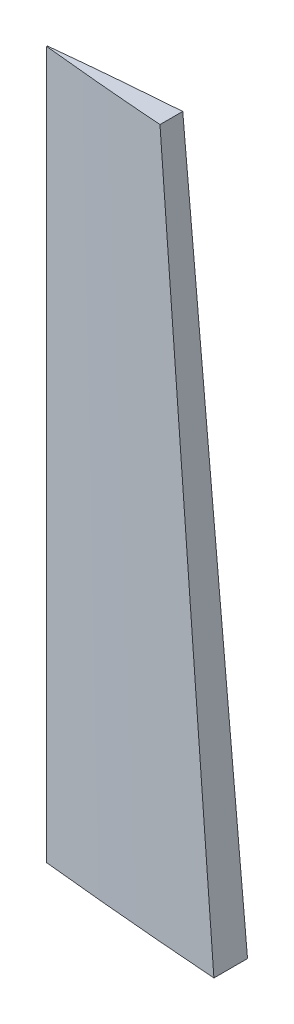
ISO-10303-21;
HEADER;
FILE_DESCRIPTION(('STEP AP214'),'2;1');
FILE_NAME('part.step','',(''),(''),'','','');
FILE_SCHEMA(('AUTOMOTIVE_DESIGN { 1 0 10303 214 1 1 1 1 }'));
ENDSEC;
DATA;
#1=APPLICATION_CONTEXT('core data for automotive mechanical design processes');
#2=APPLICATION_PROTOCOL_DEFINITION('international standard','automotive_design',2000,#1);
#3=PRODUCT_CONTEXT('',#1,'mechanical');
#4=PRODUCT('Part','Part','',(#3));
#5=PRODUCT_RELATED_PRODUCT_CATEGORY('part','',(#4));
#6=PRODUCT_DEFINITION_FORMATION('','',#4);
#7=PRODUCT_DEFINITION_CONTEXT('part definition',#1,'design');
#8=PRODUCT_DEFINITION('design','',#6,#7);
#9=PRODUCT_DEFINITION_SHAPE('','',#8);
#10=(LENGTH_UNIT() NAMED_UNIT(*) SI_UNIT(.MILLI.,.METRE.));
#11=(NAMED_UNIT(*) PLANE_ANGLE_UNIT() SI_UNIT($,.RADIAN.));
#12=(NAMED_UNIT(*) SI_UNIT($,.STERADIAN.) SOLID_ANGLE_UNIT());
#13=UNCERTAINTY_MEASURE_WITH_UNIT(LENGTH_MEASURE(1.E-05),#10,'distance_accuracy_value','');
#14=(GEOMETRIC_REPRESENTATION_CONTEXT(3) GLOBAL_UNCERTAINTY_ASSIGNED_CONTEXT((#13)) GLOBAL_UNIT_ASSIGNED_CONTEXT((#10,
#11,#12)) REPRESENTATION_CONTEXT('',''));
#15=CARTESIAN_POINT('',(0.,0.,0.));
#16=DIRECTION('',(0.,0.,1.));
#17=DIRECTION('',(1.,0.,0.));
#18=AXIS2_PLACEMENT_3D('',#15,#16,#17);
#19=CARTESIAN_POINT('',(-140.432322065666,194.49,-1.55593843981199));
#20=DIRECTION('',(0.,-1.,0.));
#21=DIRECTION('',(0.,0.,-1.));
#22=AXIS2_PLACEMENT_3D('',#19,#20,#21);
#23=PLANE('',#22);
#24=CARTESIAN_POINT('',(-125.25156,194.49,-2.77828691800495));
#25=CARTESIAN_POINT('',(-125.3651127687,194.49,-2.77027457637994));
#26=CARTESIAN_POINT('',(-127.051283805687,194.49,-2.65129748281203));
#27=CARTESIAN_POINT('',(-130.216658158444,194.49,-2.40616174222578));
#28=CARTESIAN_POINT('',(-134.639587715265,194.49,-2.05304884872815));
#29=CARTESIAN_POINT('',(-138.737880473123,194.49,-1.70632782621291));
#30=CARTESIAN_POINT('',(-142.46684265343,194.49,-1.37673059900453));
#31=CARTESIAN_POINT('',(-145.785564936787,194.49,-1.07112161812409));
#32=CARTESIAN_POINT('',(-148.657698888021,194.49,-0.797023477181364));
#33=CARTESIAN_POINT('',(-151.05177861747,194.49,-0.561384418051552));
#34=CARTESIAN_POINT('',(-152.941584481083,194.49,-0.370591439740743));
#35=CARTESIAN_POINT('',(-154.306419227171,194.49,-0.230051117494488));
#36=CARTESIAN_POINT('',(-155.131345863939,194.49,-0.143997076256146));
#37=CARTESIAN_POINT('',(-155.499662808457,194.49,-0.105279017395617));
#38=CARTESIAN_POINT('',(-155.592,194.49,-0.0955723859999983));
#39=B_SPLINE_CURVE_WITH_KNOTS('',3,(#24,#25,#26,#27,#28,#29,#30,#31,#32,#33,#34,#35,#36,#37,
#38),.UNSPECIFIED.,.F.,.F.,(4,1,1,1,1,1,1,1,1,1,1,1,4),(0.,0.0112115722778323,0.166483201337751,
0.312686160175411,0.448210552609216,0.571562715657405,0.681381362004341,0.776452466822885,
0.855722863352052,0.918312437422216,0.963524724344558,0.990855635167136,1.),.UNSPECIFIED.);
#40=CARTESIAN_POINT('',(-125.25156,194.49,-2.77828691800495));
#41=VERTEX_POINT('',#40);
#42=CARTESIAN_POINT('',(-155.592,194.49,-0.0955723859999983));
#43=VERTEX_POINT('',#42);
#44=EDGE_CURVE('E122',#41,#43,#39,.T.);
#45=ORIENTED_EDGE('',*,*,#44,.T.);
#46=DIRECTION('',(0.,0.,1.));
#47=VECTOR('',#46,1.);
#48=CARTESIAN_POINT('',(-155.592,194.49,-0.0955723859999983));
#49=LINE('',#48,#47);
#50=CARTESIAN_POINT('',(-155.592,194.49,0.0955723859999983));
#51=VERTEX_POINT('',#50);
#52=EDGE_CURVE('E254',#43,#51,#49,.T.);
#53=ORIENTED_EDGE('',*,*,#52,.T.);
#54=CARTESIAN_POINT('',(-155.592,194.49,0.0955723859999983));
#55=CARTESIAN_POINT('',(-155.499662808457,194.49,0.105279017395617));
#56=CARTESIAN_POINT('',(-155.131345863939,194.49,0.143997076256146));
#57=CARTESIAN_POINT('',(-154.306419227171,194.49,0.230051117494488));
#58=CARTESIAN_POINT('',(-152.941584481083,194.49,0.370591439740743));
#59=CARTESIAN_POINT('',(-151.05177861747,194.49,0.561384418051552));
#60=CARTESIAN_POINT('',(-148.657698888021,194.49,0.797023477181364));
#61=CARTESIAN_POINT('',(-145.785564936787,194.49,1.07112161812409));
#62=CARTESIAN_POINT('',(-142.46684265343,194.49,1.37673059900453));
#63=CARTESIAN_POINT('',(-138.737880473123,194.49,1.70632782621291));
#64=CARTESIAN_POINT('',(-134.639587715265,194.49,2.05304884872815));
#65=CARTESIAN_POINT('',(-130.216658158444,194.49,2.40616174222578));
#66=CARTESIAN_POINT('',(-127.051283805687,194.49,2.65129748281203));
#67=CARTESIAN_POINT('',(-125.3651127687,194.49,2.77027457637994));
#68=CARTESIAN_POINT('',(-125.25156,194.49,2.77828691800495));
#69=B_SPLINE_CURVE_WITH_KNOTS('',3,(#54,#55,#56,#57,#58,#59,#60,#61,#62,#63,#64,#65,#66,#67,
#68),.UNSPECIFIED.,.F.,.F.,(4,1,1,1,1,1,1,1,1,1,1,1,4),(0.,0.00914436483286374,
0.0364752756554418,0.0816875625777836,0.144277136647948,0.223547533177115,0.318618637995659,
0.428437284342595,0.551789447390784,0.687313839824589,0.833516798662249,0.988788427722168,1.),.UNSPECIFIED.);
#70=CARTESIAN_POINT('',(-125.25156,194.49,2.77828691800495));
#71=VERTEX_POINT('',#70);
#72=EDGE_CURVE('E79',#51,#71,#69,.T.);
#73=ORIENTED_EDGE('',*,*,#72,.T.);
#74=DIRECTION('',(0.,0.,-1.));
#75=VECTOR('',#74,1.);
#76=CARTESIAN_POINT('',(-125.25156,194.49,-2.77828691800495));
#77=LINE('',#76,#75);
#78=EDGE_CURVE('E12',#71,#41,#77,.T.);
#79=ORIENTED_EDGE('',*,*,#78,.T.);
#80=EDGE_LOOP('',(#45,#53,#73,#79));
#81=FACE_BOUND('',#80,.T.);
#82=ADVANCED_FACE('F69',(#81),#23,.F.);
#83=CARTESIAN_POINT('',(-133.192776457922,22.,-2.29898109194842));
#84=DIRECTION('',(0.,-1.,0.));
#85=DIRECTION('',(0.,0.,-1.));
#86=AXIS2_PLACEMENT_3D('',#83,#84,#85);
#87=PLANE('',#86);
#88=CARTESIAN_POINT('',(-110.7624,22.,-4.10506542487171));
#89=CARTESIAN_POINT('',(-110.930180203574,22.,-4.09322676761716));
#90=CARTESIAN_POINT('',(-113.421586825222,22.,-3.91743183801785));
#91=CARTESIAN_POINT('',(-118.098594346681,22.,-3.55523085490141));
#92=CARTESIAN_POINT('',(-124.633705995043,22.,-3.03348793455017));
#93=CARTESIAN_POINT('',(-130.689149654319,22.,-2.52118934062902));
#94=CARTESIAN_POINT('',(-136.198887909872,22.,-2.03419205723891));
#95=CARTESIAN_POINT('',(-141.102475085074,22.,-1.58263867273697));
#96=CARTESIAN_POINT('',(-145.346204450246,22.,-1.17764421586007));
#97=CARTESIAN_POINT('',(-148.883583494166,22.,-0.829475080370754));
#98=CARTESIAN_POINT('',(-151.675871310144,22.,-0.547568394097166));
#99=CARTESIAN_POINT('',(-153.692486617412,22.,-0.339912657062029));
#100=CARTESIAN_POINT('',(-154.911359222939,22.,-0.212763273364937));
#101=CARTESIAN_POINT('',(-155.455566930407,22.,-0.155555299733246));
#102=CARTESIAN_POINT('',(-155.592,22.,-0.141213239999997));
#103=B_SPLINE_CURVE_WITH_KNOTS('',3,(#88,#89,#90,#91,#92,#93,#94,#95,#96,#97,#98,#99,#100,#101,
#102),.UNSPECIFIED.,.F.,.F.,(4,1,1,1,1,1,1,1,1,1,1,1,4),(0.,0.011211572277832,0.166483201337751,
0.312686160175411,0.448210552609216,0.571562715657405,0.681381362004341,0.776452466822885,
0.855722863352053,0.918312437422216,0.963524724344559,0.990855635167136,1.),.UNSPECIFIED.);
#104=CARTESIAN_POINT('',(-110.7624,22.,-4.10506542487171));
#105=VERTEX_POINT('',#104);
#106=CARTESIAN_POINT('',(-155.592,22.,-0.141213239999997));
#107=VERTEX_POINT('',#106);
#108=EDGE_CURVE('E119',#105,#107,#103,.T.);
#109=ORIENTED_EDGE('',*,*,#108,.F.);
#110=DIRECTION('',(0.,0.,-1.));
#111=VECTOR('',#110,1.);
#112=CARTESIAN_POINT('',(-110.7624,22.,-4.10506542487171));
#113=LINE('',#112,#111);
#114=CARTESIAN_POINT('',(-110.7624,22.,4.10506542487171));
#115=VERTEX_POINT('',#114);
#116=EDGE_CURVE('E126',#115,#105,#113,.T.);
#117=ORIENTED_EDGE('',*,*,#116,.F.);
#118=CARTESIAN_POINT('',(-155.592,22.,0.141213239999997));
#119=CARTESIAN_POINT('',(-155.455566930407,22.,0.155555299733246));
#120=CARTESIAN_POINT('',(-154.911359222939,22.,0.212763273364937));
#121=CARTESIAN_POINT('',(-153.692486617412,22.,0.339912657062029));
#122=CARTESIAN_POINT('',(-151.675871310144,22.,0.547568394097166));
#123=CARTESIAN_POINT('',(-148.883583494166,22.,0.829475080370754));
#124=CARTESIAN_POINT('',(-145.346204450246,22.,1.17764421586007));
#125=CARTESIAN_POINT('',(-141.102475085074,22.,1.58263867273697));
#126=CARTESIAN_POINT('',(-136.198887909872,22.,2.03419205723891));
#127=CARTESIAN_POINT('',(-130.689149654319,22.,2.52118934062902));
#128=CARTESIAN_POINT('',(-124.633705995043,22.,3.03348793455017));
#129=CARTESIAN_POINT('',(-118.098594346681,22.,3.55523085490141));
#130=CARTESIAN_POINT('',(-113.421586825222,22.,3.91743183801785));
#131=CARTESIAN_POINT('',(-110.930180203574,22.,4.09322676761716));
#132=CARTESIAN_POINT('',(-110.7624,22.,4.10506542487171));
#133=B_SPLINE_CURVE_WITH_KNOTS('',3,(#118,#119,#120,#121,#122,#123,#124,#125,#126,#127,#128,
#129,#130,#131,#132),.UNSPECIFIED.,.F.,.F.,(4,1,1,1,1,1,1,1,1,1,1,1,4),(0.,0.00914436483286374,
0.0364752756554412,0.0816875625777839,0.144277136647947,0.223547533177115,0.318618637995659,
0.428437284342595,0.551789447390784,0.687313839824589,0.833516798662249,0.988788427722168,1.),.UNSPECIFIED.);
#134=CARTESIAN_POINT('',(-155.592,22.,0.141213239999997));
#135=VERTEX_POINT('',#134);
#136=EDGE_CURVE('E132',#135,#115,#133,.T.);
#137=ORIENTED_EDGE('',*,*,#136,.F.);
#138=DIRECTION('',(0.,0.,1.));
#139=VECTOR('',#138,1.);
#140=CARTESIAN_POINT('',(-155.592,22.,-0.141213239999997));
#141=LINE('',#140,#139);
#142=EDGE_CURVE('E138',#107,#135,#141,.T.);
#143=ORIENTED_EDGE('',*,*,#142,.F.);
#144=EDGE_LOOP('',(#109,#117,#137,#143));
#145=FACE_BOUND('',#144,.T.);
#146=ADVANCED_FACE('F136',(#145),#87,.T.);
#147=CARTESIAN_POINT('',(-110.7624,22.,-4.10506542487171));
#148=CARTESIAN_POINT('',(-125.25156,194.49,-2.77828691800495));
#149=CARTESIAN_POINT('',(-110.930180203574,22.,-4.09322676761716));
#150=CARTESIAN_POINT('',(-125.3651127687,194.49,-2.77027457637994));
#151=CARTESIAN_POINT('',(-113.421586825222,22.,-3.91743183801785));
#152=CARTESIAN_POINT('',(-127.051283805687,194.49,-2.65129748281203));
#153=CARTESIAN_POINT('',(-118.098594346681,22.,-3.55523085490141));
#154=CARTESIAN_POINT('',(-130.216658158444,194.49,-2.40616174222578));
#155=CARTESIAN_POINT('',(-124.633705995043,22.,-3.03348793455017));
#156=CARTESIAN_POINT('',(-134.639587715265,194.49,-2.05304884872815));
#157=CARTESIAN_POINT('',(-130.689149654319,22.,-2.52118934062902));
#158=CARTESIAN_POINT('',(-138.737880473123,194.49,-1.70632782621291));
#159=CARTESIAN_POINT('',(-136.198887909872,22.,-2.03419205723891));
#160=CARTESIAN_POINT('',(-142.46684265343,194.49,-1.37673059900453));
#161=CARTESIAN_POINT('',(-141.102475085074,22.,-1.58263867273697));
#162=CARTESIAN_POINT('',(-145.785564936787,194.49,-1.07112161812409));
#163=CARTESIAN_POINT('',(-145.346204450246,22.,-1.17764421586007));
#164=CARTESIAN_POINT('',(-148.657698888021,194.49,-0.797023477181364));
#165=CARTESIAN_POINT('',(-148.883583494166,22.,-0.829475080370754));
#166=CARTESIAN_POINT('',(-151.05177861747,194.49,-0.561384418051552));
#167=CARTESIAN_POINT('',(-151.675871310144,22.,-0.547568394097166));
#168=CARTESIAN_POINT('',(-152.941584481083,194.49,-0.370591439740743));
#169=CARTESIAN_POINT('',(-153.692486617412,22.,-0.339912657062029));
#170=CARTESIAN_POINT('',(-154.306419227171,194.49,-0.230051117494488));
#171=CARTESIAN_POINT('',(-154.911359222939,22.,-0.212763273364937));
#172=CARTESIAN_POINT('',(-155.131345863939,194.49,-0.143997076256146));
#173=CARTESIAN_POINT('',(-155.455566930407,22.,-0.155555299733246));
#174=CARTESIAN_POINT('',(-155.499662808457,194.49,-0.105279017395617));
#175=CARTESIAN_POINT('',(-155.592,22.,-0.141213239999997));
#176=CARTESIAN_POINT('',(-155.592,194.49,-0.0955723859999983));
#177=B_SPLINE_SURFACE_WITH_KNOTS('',3,1,((#147,#148),(#149,#150),(#151,#152),(#153,#154),(#155,
#156),(#157,#158),(#159,#160),(#161,#162),(#163,#164),(#165,#166),(#167,#168),(#169,#170),(#171,
#172),(#173,#174),(#175,#176)),.UNSPECIFIED.,.F.,.F.,.F.,(4,1,1,1,1,1,1,1,1,1,1,1,4),(2,2),(0.,
0.011211572277832,0.166483201337751,0.312686160175411,0.448210552609216,0.571562715657405,
0.681381362004341,0.776452466822885,0.855722863352053,0.918312437422216,0.963524724344559,
0.990855635167136,1.),(0.,1.),.UNSPECIFIED.);
#178=DIRECTION('',(0.,0.999999964993422,0.000264599990737255));
#179=VECTOR('',#178,1.);
#180=CARTESIAN_POINT('',(-155.592,108.245,-0.118392812999998));
#181=LINE('',#180,#179);
#182=EDGE_CURVE('E125',#107,#43,#181,.T.);
#183=DIRECTION('',(0.0837027483550994,-0.99646128994166,-0.00766469605437604));
#184=VECTOR('',#183,1.);
#185=CARTESIAN_POINT('',(-118.00698,108.245,-3.44167617143833));
#186=LINE('',#185,#184);
#187=EDGE_CURVE('E114',#41,#105,#186,.T.);
#188=ORIENTED_EDGE('',*,*,#108,.T.);
#189=ORIENTED_EDGE('',*,*,#182,.T.);
#190=ORIENTED_EDGE('',*,*,#44,.F.);
#191=ORIENTED_EDGE('',*,*,#187,.T.);
#192=EDGE_LOOP('',(#188,#189,#190,#191));
#193=FACE_BOUND('',#192,.T.);
#194=ADVANCED_FACE('F116',(#193),#177,.T.);
#195=CARTESIAN_POINT('',(-155.592,0.,0.));
#196=DIRECTION('',(1.,0.,0.));
#197=DIRECTION('',(0.,0.,-1.));
#198=AXIS2_PLACEMENT_3D('',#195,#196,#197);
#199=PLANE('',#198);
#200=DIRECTION('',(0.,0.999999964993422,-0.000264599990737255));
#201=VECTOR('',#200,1.);
#202=CARTESIAN_POINT('',(-155.592,22.,0.141213239999997));
#203=LINE('',#202,#201);
#204=EDGE_CURVE('E272',#135,#51,#203,.T.);
#205=ORIENTED_EDGE('',*,*,#204,.T.);
#206=ORIENTED_EDGE('',*,*,#52,.F.);
#207=ORIENTED_EDGE('',*,*,#182,.F.);
#208=ORIENTED_EDGE('',*,*,#142,.T.);
#209=EDGE_LOOP('',(#205,#206,#207,#208));
#210=FACE_BOUND('',#209,.T.);
#211=ADVANCED_FACE('F257',(#210),#199,.F.);
#212=CARTESIAN_POINT('',(-108.151284536312,-9.08470790105018,0.));
#213=DIRECTION('',(-0.996490561068874,-0.0837052071297854,0.));
#214=DIRECTION('',(0.0837052071297854,-0.996490561068874,0.));
#215=AXIS2_PLACEMENT_3D('',#212,#213,#214);
#216=PLANE('',#215);
#217=ORIENTED_EDGE('',*,*,#187,.F.);
#218=ORIENTED_EDGE('',*,*,#78,.F.);
#219=DIRECTION('',(-0.0837027483550994,0.99646128994166,-0.00766469605437604));
#220=VECTOR('',#219,1.);
#221=CARTESIAN_POINT('',(-118.00698,108.245,3.44167617143833));
#222=LINE('',#221,#220);
#223=EDGE_CURVE('E87',#115,#71,#222,.T.);
#224=ORIENTED_EDGE('',*,*,#223,.F.);
#225=ORIENTED_EDGE('',*,*,#116,.T.);
#226=EDGE_LOOP('',(#217,#218,#224,#225));
#227=FACE_BOUND('',#226,.T.);
#228=ADVANCED_FACE('F129',(#227),#216,.F.);
#229=CARTESIAN_POINT('',(-155.592,22.,0.141213239999997));
#230=CARTESIAN_POINT('',(-155.592,194.49,0.0955723859999983));
#231=CARTESIAN_POINT('',(-155.455566930407,22.,0.155555299733246));
#232=CARTESIAN_POINT('',(-155.499662808457,194.49,0.105279017395617));
#233=CARTESIAN_POINT('',(-154.911359222939,22.,0.212763273364937));
#234=CARTESIAN_POINT('',(-155.131345863939,194.49,0.143997076256146));
#235=CARTESIAN_POINT('',(-153.692486617412,22.,0.339912657062029));
#236=CARTESIAN_POINT('',(-154.306419227171,194.49,0.230051117494488));
#237=CARTESIAN_POINT('',(-151.675871310144,22.,0.547568394097166));
#238=CARTESIAN_POINT('',(-152.941584481083,194.49,0.370591439740743));
#239=CARTESIAN_POINT('',(-148.883583494166,22.,0.829475080370754));
#240=CARTESIAN_POINT('',(-151.05177861747,194.49,0.561384418051552));
#241=CARTESIAN_POINT('',(-145.346204450246,22.,1.17764421586007));
#242=CARTESIAN_POINT('',(-148.657698888021,194.49,0.797023477181364));
#243=CARTESIAN_POINT('',(-141.102475085074,22.,1.58263867273697));
#244=CARTESIAN_POINT('',(-145.785564936787,194.49,1.07112161812409));
#245=CARTESIAN_POINT('',(-136.198887909872,22.,2.03419205723891));
#246=CARTESIAN_POINT('',(-142.46684265343,194.49,1.37673059900453));
#247=CARTESIAN_POINT('',(-130.689149654319,22.,2.52118934062902));
#248=CARTESIAN_POINT('',(-138.737880473123,194.49,1.70632782621291));
#249=CARTESIAN_POINT('',(-124.633705995043,22.,3.03348793455017));
#250=CARTESIAN_POINT('',(-134.639587715265,194.49,2.05304884872815));
#251=CARTESIAN_POINT('',(-118.098594346681,22.,3.55523085490141));
#252=CARTESIAN_POINT('',(-130.216658158444,194.49,2.40616174222578));
#253=CARTESIAN_POINT('',(-113.421586825222,22.,3.91743183801785));
#254=CARTESIAN_POINT('',(-127.051283805687,194.49,2.65129748281203));
#255=CARTESIAN_POINT('',(-110.930180203574,22.,4.09322676761716));
#256=CARTESIAN_POINT('',(-125.3651127687,194.49,2.77027457637994));
#257=CARTESIAN_POINT('',(-110.7624,22.,4.10506542487171));
#258=CARTESIAN_POINT('',(-125.25156,194.49,2.77828691800495));
#259=B_SPLINE_SURFACE_WITH_KNOTS('',3,1,((#229,#230),(#231,#232),(#233,#234),(#235,#236),(#237,
#238),(#239,#240),(#241,#242),(#243,#244),(#245,#246),(#247,#248),(#249,#250),(#251,#252),(#253,
#254),(#255,#256),(#257,#258)),.UNSPECIFIED.,.F.,.F.,.F.,(4,1,1,1,1,1,1,1,1,1,1,1,4),(2,2),(0.,
0.00914436483286374,0.0364752756554412,0.0816875625777839,0.144277136647947,0.223547533177115,
0.318618637995659,0.428437284342595,0.551789447390784,0.687313839824589,0.833516798662249,
0.988788427722168,1.),(0.,1.),.UNSPECIFIED.);
#260=ORIENTED_EDGE('',*,*,#136,.T.);
#261=ORIENTED_EDGE('',*,*,#223,.T.);
#262=ORIENTED_EDGE('',*,*,#72,.F.);
#263=ORIENTED_EDGE('',*,*,#204,.F.);
#264=EDGE_LOOP('',(#260,#261,#262,#263));
#265=FACE_BOUND('',#264,.T.);
#266=ADVANCED_FACE('F205',(#265),#259,.T.);
#267=CLOSED_SHELL('',(#82,#146,#194,#211,#228,#266));
#268=MANIFOLD_SOLID_BREP('B2',#267);
#269=ADVANCED_BREP_SHAPE_REPRESENTATION('',(#18,#268),#14);
#270=SHAPE_DEFINITION_REPRESENTATION(#9,#269);
ENDSEC;
END-ISO-10303-21;
